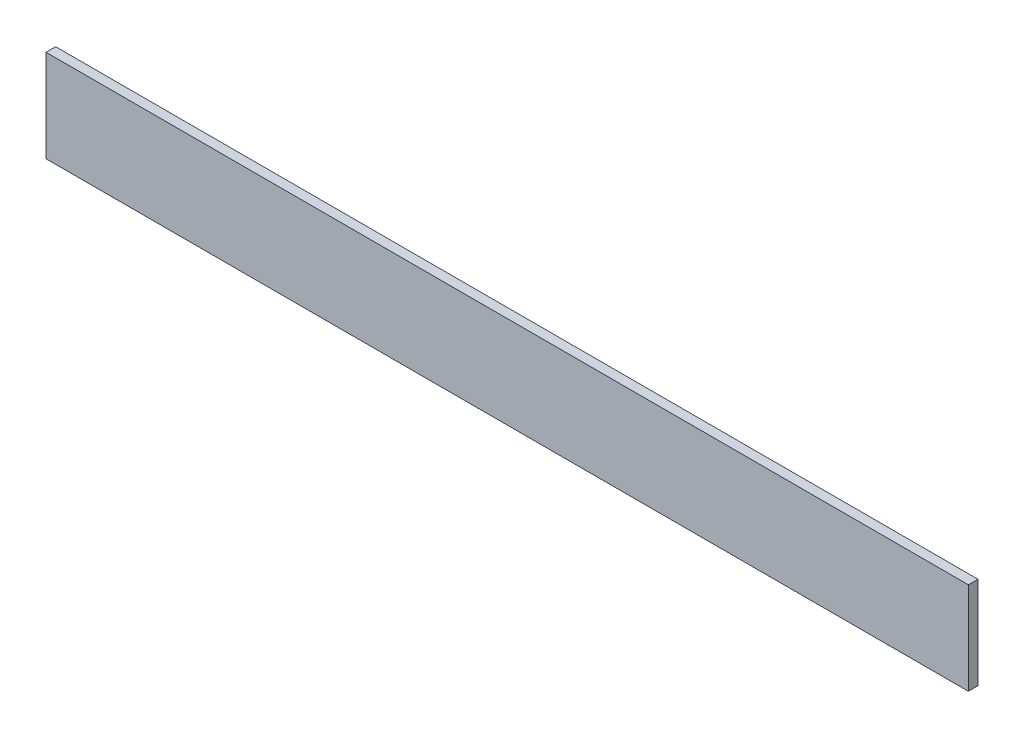
ISO-10303-21;
HEADER;
FILE_DESCRIPTION(('STEP AP214'),'2;1');
FILE_NAME('part.step','',(''),(''),'','','');
FILE_SCHEMA(('AUTOMOTIVE_DESIGN { 1 0 10303 214 1 1 1 1 }'));
ENDSEC;
DATA;
#1=APPLICATION_CONTEXT('core data for automotive mechanical design processes');
#2=APPLICATION_PROTOCOL_DEFINITION('international standard','automotive_design',2000,#1);
#3=PRODUCT_CONTEXT('',#1,'mechanical');
#4=PRODUCT('Part','Part','',(#3));
#5=PRODUCT_RELATED_PRODUCT_CATEGORY('part','',(#4));
#6=PRODUCT_DEFINITION_FORMATION('','',#4);
#7=PRODUCT_DEFINITION_CONTEXT('part definition',#1,'design');
#8=PRODUCT_DEFINITION('design','',#6,#7);
#9=PRODUCT_DEFINITION_SHAPE('','',#8);
#10=(LENGTH_UNIT() NAMED_UNIT(*) SI_UNIT(.MILLI.,.METRE.));
#11=(NAMED_UNIT(*) PLANE_ANGLE_UNIT() SI_UNIT($,.RADIAN.));
#12=(NAMED_UNIT(*) SI_UNIT($,.STERADIAN.) SOLID_ANGLE_UNIT());
#13=UNCERTAINTY_MEASURE_WITH_UNIT(LENGTH_MEASURE(1.E-05),#10,'distance_accuracy_value','');
#14=(GEOMETRIC_REPRESENTATION_CONTEXT(3) GLOBAL_UNCERTAINTY_ASSIGNED_CONTEXT((#13)) GLOBAL_UNIT_ASSIGNED_CONTEXT((#10,
#11,#12)) REPRESENTATION_CONTEXT('',''));
#15=CARTESIAN_POINT('',(0.,0.,0.));
#16=DIRECTION('',(0.,0.,1.));
#17=DIRECTION('',(1.,0.,0.));
#18=AXIS2_PLACEMENT_3D('',#15,#16,#17);
#19=CARTESIAN_POINT('',(0.,1000.,0.));
#20=DIRECTION('',(1.,0.,0.));
#21=DIRECTION('',(0.,0.,-1.));
#22=AXIS2_PLACEMENT_3D('',#19,#20,#21);
#23=PLANE('',#22);
#24=DIRECTION('',(0.,0.,1.));
#25=VECTOR('',#24,1.);
#26=CARTESIAN_POINT('',(0.,0.,0.));
#27=LINE('',#26,#25);
#28=CARTESIAN_POINT('',(0.,0.,0.));
#29=VERTEX_POINT('',#28);
#30=CARTESIAN_POINT('',(0.,0.,104.446930850985));
#31=VERTEX_POINT('',#30);
#32=EDGE_CURVE('E98',#29,#31,#27,.T.);
#33=ORIENTED_EDGE('',*,*,#32,.T.);
#34=DIRECTION('',(0.,-1.,0.));
#35=VECTOR('',#34,1.);
#36=CARTESIAN_POINT('',(0.,1000.,104.446930850985));
#37=LINE('',#36,#35);
#38=CARTESIAN_POINT('',(0.,1000.,104.446930850985));
#39=VERTEX_POINT('',#38);
#40=EDGE_CURVE('E11',#39,#31,#37,.T.);
#41=ORIENTED_EDGE('',*,*,#40,.F.);
#42=DIRECTION('',(0.,0.,1.));
#43=VECTOR('',#42,1.);
#44=CARTESIAN_POINT('',(0.,1000.,0.));
#45=LINE('',#44,#43);
#46=CARTESIAN_POINT('',(0.,1000.,0.));
#47=VERTEX_POINT('',#46);
#48=EDGE_CURVE('E86',#47,#39,#45,.T.);
#49=ORIENTED_EDGE('',*,*,#48,.F.);
#50=DIRECTION('',(0.,-1.,0.));
#51=VECTOR('',#50,1.);
#52=CARTESIAN_POINT('',(0.,1000.,0.));
#53=LINE('',#52,#51);
#54=EDGE_CURVE('E94',#47,#29,#53,.T.);
#55=ORIENTED_EDGE('',*,*,#54,.T.);
#56=EDGE_LOOP('',(#33,#41,#49,#55));
#57=FACE_BOUND('',#56,.T.);
#58=ADVANCED_FACE('F35',(#57),#23,.F.);
#59=CARTESIAN_POINT('',(0.,1000.,104.446930850985));
#60=DIRECTION('',(0.,0.,-1.));
#61=DIRECTION('',(-1.,0.,0.));
#62=AXIS2_PLACEMENT_3D('',#59,#60,#61);
#63=PLANE('',#62);
#64=DIRECTION('',(1.,0.,0.));
#65=VECTOR('',#64,1.);
#66=CARTESIAN_POINT('',(0.,0.,104.446930850985));
#67=LINE('',#66,#65);
#68=CARTESIAN_POINT('',(10000.,0.,104.446930850985));
#69=VERTEX_POINT('',#68);
#70=EDGE_CURVE('E90',#31,#69,#67,.T.);
#71=ORIENTED_EDGE('',*,*,#70,.T.);
#72=DIRECTION('',(0.,-1.,0.));
#73=VECTOR('',#72,1.);
#74=CARTESIAN_POINT('',(10000.,1000.,104.446930850985));
#75=LINE('',#74,#73);
#76=CARTESIAN_POINT('',(10000.,1000.,104.446930850985));
#77=VERTEX_POINT('',#76);
#78=EDGE_CURVE('E43',#77,#69,#75,.T.);
#79=ORIENTED_EDGE('',*,*,#78,.F.);
#80=DIRECTION('',(1.,0.,0.));
#81=VECTOR('',#80,1.);
#82=CARTESIAN_POINT('',(0.,1000.,104.446930850985));
#83=LINE('',#82,#81);
#84=EDGE_CURVE('E81',#39,#77,#83,.T.);
#85=ORIENTED_EDGE('',*,*,#84,.F.);
#86=ORIENTED_EDGE('',*,*,#40,.T.);
#87=EDGE_LOOP('',(#71,#79,#85,#86));
#88=FACE_BOUND('',#87,.T.);
#89=ADVANCED_FACE('F89',(#88),#63,.F.);
#90=CARTESIAN_POINT('',(10000.,1000.,0.));
#91=DIRECTION('',(-1.,0.,0.));
#92=DIRECTION('',(0.,0.,1.));
#93=AXIS2_PLACEMENT_3D('',#90,#91,#92);
#94=PLANE('',#93);
#95=DIRECTION('',(0.,0.,-1.));
#96=VECTOR('',#95,1.);
#97=CARTESIAN_POINT('',(10000.,0.,0.));
#98=LINE('',#97,#96);
#99=CARTESIAN_POINT('',(10000.,0.,0.));
#100=VERTEX_POINT('',#99);
#101=EDGE_CURVE('E68',#69,#100,#98,.T.);
#102=ORIENTED_EDGE('',*,*,#101,.T.);
#103=DIRECTION('',(0.,-1.,0.));
#104=VECTOR('',#103,1.);
#105=CARTESIAN_POINT('',(10000.,1000.,0.));
#106=LINE('',#105,#104);
#107=CARTESIAN_POINT('',(10000.,1000.,0.));
#108=VERTEX_POINT('',#107);
#109=EDGE_CURVE('E91',#108,#100,#106,.T.);
#110=ORIENTED_EDGE('',*,*,#109,.F.);
#111=DIRECTION('',(0.,0.,-1.));
#112=VECTOR('',#111,1.);
#113=CARTESIAN_POINT('',(10000.,1000.,0.));
#114=LINE('',#113,#112);
#115=EDGE_CURVE('E84',#77,#108,#114,.T.);
#116=ORIENTED_EDGE('',*,*,#115,.F.);
#117=ORIENTED_EDGE('',*,*,#78,.T.);
#118=EDGE_LOOP('',(#102,#110,#116,#117));
#119=FACE_BOUND('',#118,.T.);
#120=ADVANCED_FACE('F92',(#119),#94,.F.);
#121=CARTESIAN_POINT('',(0.,1000.,0.));
#122=DIRECTION('',(0.,0.,1.));
#123=DIRECTION('',(1.,0.,0.));
#124=AXIS2_PLACEMENT_3D('',#121,#122,#123);
#125=PLANE('',#124);
#126=DIRECTION('',(-1.,0.,0.));
#127=VECTOR('',#126,1.);
#128=CARTESIAN_POINT('',(0.,0.,0.));
#129=LINE('',#128,#127);
#130=EDGE_CURVE('E74',#100,#29,#129,.T.);
#131=ORIENTED_EDGE('',*,*,#130,.T.);
#132=ORIENTED_EDGE('',*,*,#54,.F.);
#133=DIRECTION('',(-1.,0.,0.));
#134=VECTOR('',#133,1.);
#135=CARTESIAN_POINT('',(0.,1000.,0.));
#136=LINE('',#135,#134);
#137=EDGE_CURVE('E51',#108,#47,#136,.T.);
#138=ORIENTED_EDGE('',*,*,#137,.F.);
#139=ORIENTED_EDGE('',*,*,#109,.T.);
#140=EDGE_LOOP('',(#131,#132,#138,#139));
#141=FACE_BOUND('',#140,.T.);
#142=ADVANCED_FACE('F105',(#141),#125,.F.);
#143=CARTESIAN_POINT('',(0.,1000.,0.));
#144=DIRECTION('',(0.,1.,0.));
#145=DIRECTION('',(0.,0.,1.));
#146=AXIS2_PLACEMENT_3D('',#143,#144,#145);
#147=PLANE('',#146);
#148=ORIENTED_EDGE('',*,*,#48,.T.);
#149=ORIENTED_EDGE('',*,*,#84,.T.);
#150=ORIENTED_EDGE('',*,*,#115,.T.);
#151=ORIENTED_EDGE('',*,*,#137,.T.);
#152=EDGE_LOOP('',(#148,#149,#150,#151));
#153=FACE_BOUND('',#152,.T.);
#154=ADVANCED_FACE('F82',(#153),#147,.T.);
#155=CARTESIAN_POINT('',(0.,0.,0.));
#156=DIRECTION('',(0.,1.,0.));
#157=DIRECTION('',(0.,0.,1.));
#158=AXIS2_PLACEMENT_3D('',#155,#156,#157);
#159=PLANE('',#158);
#160=ORIENTED_EDGE('',*,*,#32,.F.);
#161=ORIENTED_EDGE('',*,*,#130,.F.);
#162=ORIENTED_EDGE('',*,*,#101,.F.);
#163=ORIENTED_EDGE('',*,*,#70,.F.);
#164=EDGE_LOOP('',(#160,#161,#162,#163));
#165=FACE_BOUND('',#164,.T.);
#166=ADVANCED_FACE('F108',(#165),#159,.F.);
#167=CLOSED_SHELL('',(#58,#89,#120,#142,#154,#166));
#168=MANIFOLD_SOLID_BREP('B2',#167);
#169=ADVANCED_BREP_SHAPE_REPRESENTATION('',(#18,#168),#14);
#170=SHAPE_DEFINITION_REPRESENTATION(#9,#169);
ENDSEC;
END-ISO-10303-21;
